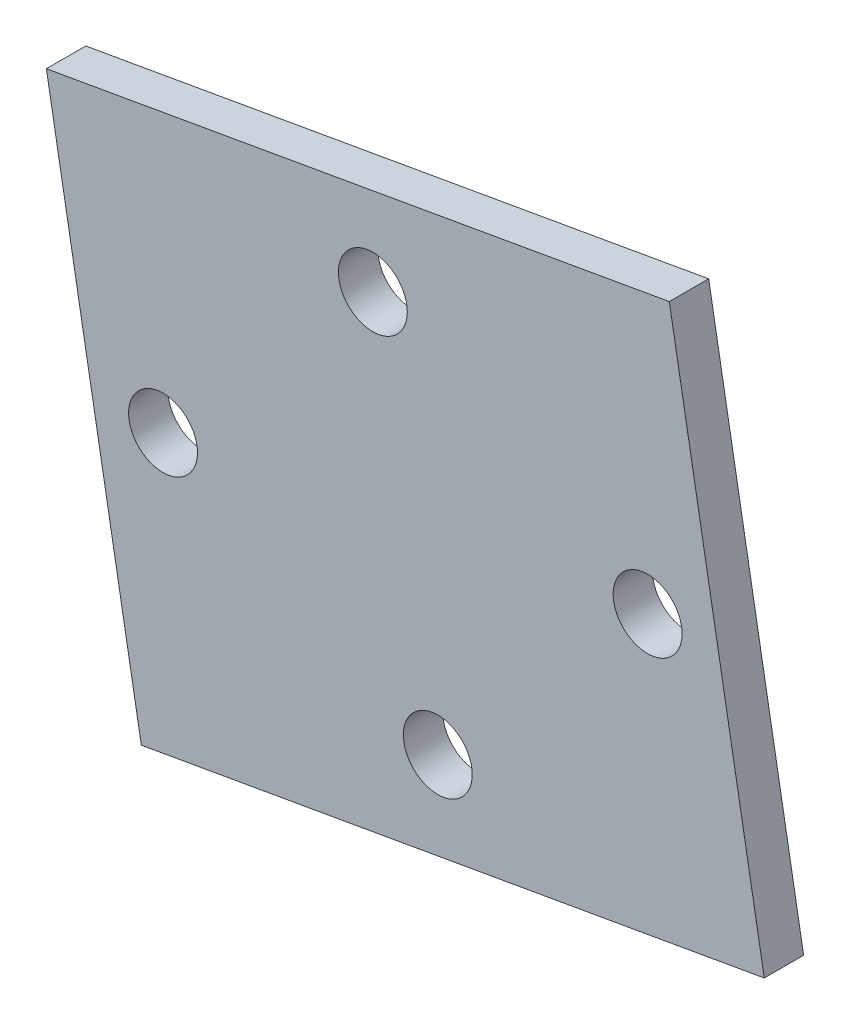
ISO-10303-21;
HEADER;
FILE_DESCRIPTION(('STEP AP214'),'2;1');
FILE_NAME('part.step','',(''),(''),'','','');
FILE_SCHEMA(('AUTOMOTIVE_DESIGN { 1 0 10303 214 1 1 1 1 }'));
ENDSEC;
DATA;
#1=APPLICATION_CONTEXT('core data for automotive mechanical design processes');
#2=APPLICATION_PROTOCOL_DEFINITION('international standard','automotive_design',2000,#1);
#3=PRODUCT_CONTEXT('',#1,'mechanical');
#4=PRODUCT('Part','Part','',(#3));
#5=PRODUCT_RELATED_PRODUCT_CATEGORY('part','',(#4));
#6=PRODUCT_DEFINITION_FORMATION('','',#4);
#7=PRODUCT_DEFINITION_CONTEXT('part definition',#1,'design');
#8=PRODUCT_DEFINITION('design','',#6,#7);
#9=PRODUCT_DEFINITION_SHAPE('','',#8);
#10=(LENGTH_UNIT() NAMED_UNIT(*) SI_UNIT(.MILLI.,.METRE.));
#11=(NAMED_UNIT(*) PLANE_ANGLE_UNIT() SI_UNIT($,.RADIAN.));
#12=(NAMED_UNIT(*) SI_UNIT($,.STERADIAN.) SOLID_ANGLE_UNIT());
#13=UNCERTAINTY_MEASURE_WITH_UNIT(LENGTH_MEASURE(1.E-05),#10,'distance_accuracy_value','');
#14=(GEOMETRIC_REPRESENTATION_CONTEXT(3) GLOBAL_UNCERTAINTY_ASSIGNED_CONTEXT((#13)) GLOBAL_UNIT_ASSIGNED_CONTEXT((#10,
#11,#12)) REPRESENTATION_CONTEXT('',''));
#15=CARTESIAN_POINT('',(0.,0.,0.));
#16=DIRECTION('',(0.,0.,1.));
#17=DIRECTION('',(1.,0.,0.));
#18=AXIS2_PLACEMENT_3D('',#15,#16,#17);
#19=CARTESIAN_POINT('',(15.8240886904825,2.79021378125586,1.));
#20=DIRECTION('',(0.984807753012207,0.173648177666938,0.));
#21=DIRECTION('',(-0.173648177666938,0.984807753012207,0.));
#22=AXIS2_PLACEMENT_3D('',#19,#20,#21);
#23=PLANE('',#22);
#24=DIRECTION('',(0.173648177666938,-0.984807753012207,0.));
#25=VECTOR('',#24,1.);
#26=CARTESIAN_POINT('',(15.8240886904825,2.79021378125586,-1.));
#27=LINE('',#26,#25);
#28=CARTESIAN_POINT('',(13.4127531902257,16.4655769648603,-1.));
#29=VERTEX_POINT('',#28);
#30=CARTESIAN_POINT('',(18.2354241907393,-10.8851494023485,-1.));
#31=VERTEX_POINT('',#30);
#32=EDGE_CURVE('E131',#29,#31,#27,.T.);
#33=ORIENTED_EDGE('',*,*,#32,.F.);
#34=DIRECTION('',(0.,0.,-1.));
#35=VECTOR('',#34,1.);
#36=CARTESIAN_POINT('',(13.4127531902257,16.4655769648603,1.));
#37=LINE('',#36,#35);
#38=CARTESIAN_POINT('',(13.4127531902257,16.4655769648603,1.));
#39=VERTEX_POINT('',#38);
#40=EDGE_CURVE('E11',#39,#29,#37,.T.);
#41=ORIENTED_EDGE('',*,*,#40,.F.);
#42=DIRECTION('',(0.173648177666938,-0.984807753012207,0.));
#43=VECTOR('',#42,1.);
#44=CARTESIAN_POINT('',(15.8240886904825,2.79021378125586,1.));
#45=LINE('',#44,#43);
#46=CARTESIAN_POINT('',(18.2354241907393,-10.8851494023485,1.));
#47=VERTEX_POINT('',#46);
#48=EDGE_CURVE('E106',#39,#47,#45,.T.);
#49=ORIENTED_EDGE('',*,*,#48,.T.);
#50=DIRECTION('',(0.,0.,-1.));
#51=VECTOR('',#50,1.);
#52=CARTESIAN_POINT('',(18.2354241907393,-10.8851494023485,1.));
#53=LINE('',#52,#51);
#54=EDGE_CURVE('E84',#47,#31,#53,.T.);
#55=ORIENTED_EDGE('',*,*,#54,.T.);
#56=EDGE_LOOP('',(#33,#41,#49,#55));
#57=FACE_BOUND('',#56,.T.);
#58=ADVANCED_FACE('F45',(#57),#23,.T.);
#59=CARTESIAN_POINT('',(-2.41133550025677,13.6753631836044,1.));
#60=DIRECTION('',(-0.173648177666938,0.984807753012207,0.));
#61=DIRECTION('',(-0.984807753012207,-0.173648177666938,0.));
#62=AXIS2_PLACEMENT_3D('',#59,#60,#61);
#63=PLANE('',#62);
#64=DIRECTION('',(0.984807753012207,0.173648177666938,0.));
#65=VECTOR('',#64,1.);
#66=CARTESIAN_POINT('',(-2.41133550025677,13.6753631836044,-1.));
#67=LINE('',#66,#65);
#68=CARTESIAN_POINT('',(-18.2354241907393,10.8851494023485,-1.));
#69=VERTEX_POINT('',#68);
#70=EDGE_CURVE('E97',#69,#29,#67,.T.);
#71=ORIENTED_EDGE('',*,*,#70,.F.);
#72=DIRECTION('',(0.,0.,-1.));
#73=VECTOR('',#72,1.);
#74=CARTESIAN_POINT('',(-18.2354241907393,10.8851494023485,1.));
#75=LINE('',#74,#73);
#76=CARTESIAN_POINT('',(-18.2354241907393,10.8851494023485,1.));
#77=VERTEX_POINT('',#76);
#78=EDGE_CURVE('E54',#77,#69,#75,.T.);
#79=ORIENTED_EDGE('',*,*,#78,.F.);
#80=DIRECTION('',(0.984807753012207,0.173648177666938,0.));
#81=VECTOR('',#80,1.);
#82=CARTESIAN_POINT('',(-2.41133550025677,13.6753631836044,1.));
#83=LINE('',#82,#81);
#84=EDGE_CURVE('E95',#77,#39,#83,.T.);
#85=ORIENTED_EDGE('',*,*,#84,.T.);
#86=ORIENTED_EDGE('',*,*,#40,.T.);
#87=EDGE_LOOP('',(#71,#79,#85,#86));
#88=FACE_BOUND('',#87,.T.);
#89=ADVANCED_FACE('F93',(#88),#63,.T.);
#90=CARTESIAN_POINT('',(-15.8240886904825,-2.79021378125586,1.));
#91=DIRECTION('',(0.984807753012207,0.173648177666938,0.));
#92=DIRECTION('',(-0.173648177666938,0.984807753012207,0.));
#93=AXIS2_PLACEMENT_3D('',#90,#91,#92);
#94=PLANE('',#93);
#95=DIRECTION('',(0.173648177666938,-0.984807753012207,0.));
#96=VECTOR('',#95,1.);
#97=CARTESIAN_POINT('',(-15.8240886904825,-2.79021378125586,-1.));
#98=LINE('',#97,#96);
#99=CARTESIAN_POINT('',(-13.4127531902257,-16.4655769648603,-1.));
#100=VERTEX_POINT('',#99);
#101=EDGE_CURVE('E77',#69,#100,#98,.T.);
#102=ORIENTED_EDGE('',*,*,#101,.T.);
#103=DIRECTION('',(0.,0.,-1.));
#104=VECTOR('',#103,1.);
#105=CARTESIAN_POINT('',(-13.4127531902257,-16.4655769648603,1.));
#106=LINE('',#105,#104);
#107=CARTESIAN_POINT('',(-13.4127531902257,-16.4655769648603,1.));
#108=VERTEX_POINT('',#107);
#109=EDGE_CURVE('E99',#108,#100,#106,.T.);
#110=ORIENTED_EDGE('',*,*,#109,.F.);
#111=DIRECTION('',(0.173648177666938,-0.984807753012207,0.));
#112=VECTOR('',#111,1.);
#113=CARTESIAN_POINT('',(-15.8240886904825,-2.79021378125586,1.));
#114=LINE('',#113,#112);
#115=EDGE_CURVE('E100',#77,#108,#114,.T.);
#116=ORIENTED_EDGE('',*,*,#115,.F.);
#117=ORIENTED_EDGE('',*,*,#78,.T.);
#118=EDGE_LOOP('',(#102,#110,#116,#117));
#119=FACE_BOUND('',#118,.T.);
#120=ADVANCED_FACE('F101',(#119),#94,.F.);
#121=CARTESIAN_POINT('',(-12.3100969126526,-2.17060222083673,1.));
#122=DIRECTION('',(0.,0.,-1.));
#123=DIRECTION('',(-1.,0.,0.));
#124=AXIS2_PLACEMENT_3D('',#121,#122,#123);
#125=CYLINDRICAL_SURFACE('',#124,1.75);
#126=CARTESIAN_POINT('',(-12.3100969126526,-2.17060222083673,1.));
#127=DIRECTION('',(0.,0.,1.));
#128=DIRECTION('',(1.,0.,0.));
#129=AXIS2_PLACEMENT_3D('',#126,#127,#128);
#130=CIRCLE('',#129,1.75);
#131=CARTESIAN_POINT('',(-10.5600969126526,-2.17060222083673,1.));
#132=VERTEX_POINT('',#131);
#133=EDGE_CURVE('E123',#132,#132,#130,.T.);
#134=ORIENTED_EDGE('',*,*,#133,.T.);
#135=EDGE_LOOP('',(#134));
#136=FACE_BOUND('',#135,.T.);
#137=CARTESIAN_POINT('',(-12.3100969126526,-2.17060222083673,-1.));
#138=DIRECTION('',(0.,0.,1.));
#139=DIRECTION('',(1.,0.,0.));
#140=AXIS2_PLACEMENT_3D('',#137,#138,#139);
#141=CIRCLE('',#140,1.75);
#142=CARTESIAN_POINT('',(-10.5600969126526,-2.17060222083673,-1.));
#143=VERTEX_POINT('',#142);
#144=EDGE_CURVE('E150',#143,#143,#141,.T.);
#145=ORIENTED_EDGE('',*,*,#144,.F.);
#146=EDGE_LOOP('',(#145));
#147=FACE_BOUND('',#146,.T.);
#148=ADVANCED_FACE('F173',(#136,#147),#125,.F.);
#149=CARTESIAN_POINT('',(1.64965768783591,-9.35567365361596,1.));
#150=DIRECTION('',(0.,0.,-1.));
#151=DIRECTION('',(-1.,0.,0.));
#152=AXIS2_PLACEMENT_3D('',#149,#150,#151);
#153=CYLINDRICAL_SURFACE('',#152,1.75);
#154=CARTESIAN_POINT('',(1.64965768783591,-9.35567365361596,1.));
#155=DIRECTION('',(0.,0.,1.));
#156=DIRECTION('',(1.,0.,0.));
#157=AXIS2_PLACEMENT_3D('',#154,#155,#156);
#158=CIRCLE('',#157,1.75);
#159=CARTESIAN_POINT('',(3.39965768783591,-9.35567365361596,1.));
#160=VERTEX_POINT('',#159);
#161=EDGE_CURVE('E119',#160,#160,#158,.T.);
#162=ORIENTED_EDGE('',*,*,#161,.T.);
#163=EDGE_LOOP('',(#162));
#164=FACE_BOUND('',#163,.T.);
#165=CARTESIAN_POINT('',(1.64965768783591,-9.35567365361596,-1.));
#166=DIRECTION('',(0.,0.,1.));
#167=DIRECTION('',(1.,0.,0.));
#168=AXIS2_PLACEMENT_3D('',#165,#166,#167);
#169=CIRCLE('',#168,1.75);
#170=CARTESIAN_POINT('',(3.39965768783591,-9.35567365361596,-1.));
#171=VERTEX_POINT('',#170);
#172=EDGE_CURVE('E146',#171,#171,#169,.T.);
#173=ORIENTED_EDGE('',*,*,#172,.F.);
#174=EDGE_LOOP('',(#173));
#175=FACE_BOUND('',#174,.T.);
#176=ADVANCED_FACE('F182',(#164,#175),#153,.F.);
#177=CARTESIAN_POINT('',(12.3100969126526,2.17060222083672,1.));
#178=DIRECTION('',(0.,0.,-1.));
#179=DIRECTION('',(-1.,0.,0.));
#180=AXIS2_PLACEMENT_3D('',#177,#178,#179);
#181=CYLINDRICAL_SURFACE('',#180,1.75);
#182=CARTESIAN_POINT('',(12.3100969126526,2.17060222083672,1.));
#183=DIRECTION('',(0.,0.,1.));
#184=DIRECTION('',(1.,0.,0.));
#185=AXIS2_PLACEMENT_3D('',#182,#183,#184);
#186=CIRCLE('',#185,1.75);
#187=CARTESIAN_POINT('',(14.0600969126526,2.17060222083672,1.));
#188=VERTEX_POINT('',#187);
#189=EDGE_CURVE('E115',#188,#188,#186,.T.);
#190=ORIENTED_EDGE('',*,*,#189,.T.);
#191=EDGE_LOOP('',(#190));
#192=FACE_BOUND('',#191,.T.);
#193=CARTESIAN_POINT('',(12.3100969126526,2.17060222083672,-1.));
#194=DIRECTION('',(0.,0.,1.));
#195=DIRECTION('',(1.,0.,0.));
#196=AXIS2_PLACEMENT_3D('',#193,#194,#195);
#197=CIRCLE('',#196,1.75);
#198=CARTESIAN_POINT('',(14.0600969126526,2.17060222083672,-1.));
#199=VERTEX_POINT('',#198);
#200=EDGE_CURVE('E142',#199,#199,#197,.T.);
#201=ORIENTED_EDGE('',*,*,#200,.F.);
#202=EDGE_LOOP('',(#201));
#203=FACE_BOUND('',#202,.T.);
#204=ADVANCED_FACE('F179',(#192,#203),#181,.F.);
#205=CARTESIAN_POINT('',(2.41133550025677,-13.6753631836044,1.));
#206=DIRECTION('',(-0.173648177666938,0.984807753012207,0.));
#207=DIRECTION('',(-0.984807753012207,-0.173648177666938,0.));
#208=AXIS2_PLACEMENT_3D('',#205,#206,#207);
#209=PLANE('',#208);
#210=DIRECTION('',(0.984807753012207,0.173648177666938,0.));
#211=VECTOR('',#210,1.);
#212=CARTESIAN_POINT('',(2.41133550025677,-13.6753631836044,-1.));
#213=LINE('',#212,#211);
#214=EDGE_CURVE('E139',#100,#31,#213,.T.);
#215=ORIENTED_EDGE('',*,*,#214,.T.);
#216=ORIENTED_EDGE('',*,*,#54,.F.);
#217=DIRECTION('',(0.984807753012207,0.173648177666938,0.));
#218=VECTOR('',#217,1.);
#219=CARTESIAN_POINT('',(2.41133550025677,-13.6753631836044,1.));
#220=LINE('',#219,#218);
#221=EDGE_CURVE('E62',#108,#47,#220,.T.);
#222=ORIENTED_EDGE('',*,*,#221,.F.);
#223=ORIENTED_EDGE('',*,*,#109,.T.);
#224=EDGE_LOOP('',(#215,#216,#222,#223));
#225=FACE_BOUND('',#224,.T.);
#226=ADVANCED_FACE('F162',(#225),#209,.F.);
#227=CARTESIAN_POINT('',(-1.64965768783591,9.35567365361597,1.));
#228=DIRECTION('',(0.,0.,-1.));
#229=DIRECTION('',(-1.,0.,0.));
#230=AXIS2_PLACEMENT_3D('',#227,#228,#229);
#231=CYLINDRICAL_SURFACE('',#230,1.75);
#232=CARTESIAN_POINT('',(-1.64965768783591,9.35567365361597,1.));
#233=DIRECTION('',(0.,0.,1.));
#234=DIRECTION('',(1.,0.,0.));
#235=AXIS2_PLACEMENT_3D('',#232,#233,#234);
#236=CIRCLE('',#235,1.75);
#237=CARTESIAN_POINT('',(0.100342312164093,9.35567365361597,1.));
#238=VERTEX_POINT('',#237);
#239=EDGE_CURVE('E127',#238,#238,#236,.T.);
#240=ORIENTED_EDGE('',*,*,#239,.T.);
#241=EDGE_LOOP('',(#240));
#242=FACE_BOUND('',#241,.T.);
#243=CARTESIAN_POINT('',(-1.64965768783591,9.35567365361597,-1.));
#244=DIRECTION('',(0.,0.,1.));
#245=DIRECTION('',(1.,0.,0.));
#246=AXIS2_PLACEMENT_3D('',#243,#244,#245);
#247=CIRCLE('',#246,1.75);
#248=CARTESIAN_POINT('',(0.100342312164093,9.35567365361597,-1.));
#249=VERTEX_POINT('',#248);
#250=EDGE_CURVE('E110',#249,#249,#247,.T.);
#251=ORIENTED_EDGE('',*,*,#250,.F.);
#252=EDGE_LOOP('',(#251));
#253=FACE_BOUND('',#252,.T.);
#254=ADVANCED_FACE('F178',(#242,#253),#231,.F.);
#255=CARTESIAN_POINT('',(0.,0.,1.));
#256=DIRECTION('',(0.,0.,1.));
#257=DIRECTION('',(1.,0.,0.));
#258=AXIS2_PLACEMENT_3D('',#255,#256,#257);
#259=PLANE('',#258);
#260=ORIENTED_EDGE('',*,*,#48,.F.);
#261=ORIENTED_EDGE('',*,*,#84,.F.);
#262=ORIENTED_EDGE('',*,*,#115,.T.);
#263=ORIENTED_EDGE('',*,*,#221,.T.);
#264=EDGE_LOOP('',(#260,#261,#262,#263));
#265=FACE_BOUND('',#264,.T.);
#266=ORIENTED_EDGE('',*,*,#189,.F.);
#267=EDGE_LOOP('',(#266));
#268=FACE_BOUND('',#267,.T.);
#269=ORIENTED_EDGE('',*,*,#161,.F.);
#270=EDGE_LOOP('',(#269));
#271=FACE_BOUND('',#270,.T.);
#272=ORIENTED_EDGE('',*,*,#133,.F.);
#273=EDGE_LOOP('',(#272));
#274=FACE_BOUND('',#273,.T.);
#275=ORIENTED_EDGE('',*,*,#239,.F.);
#276=EDGE_LOOP('',(#275));
#277=FACE_BOUND('',#276,.T.);
#278=ADVANCED_FACE('F104',(#265,#268,#271,#274,#277),#259,.T.);
#279=CARTESIAN_POINT('',(0.,0.,-1.));
#280=DIRECTION('',(0.,0.,1.));
#281=DIRECTION('',(1.,0.,0.));
#282=AXIS2_PLACEMENT_3D('',#279,#280,#281);
#283=PLANE('',#282);
#284=ORIENTED_EDGE('',*,*,#32,.T.);
#285=ORIENTED_EDGE('',*,*,#214,.F.);
#286=ORIENTED_EDGE('',*,*,#101,.F.);
#287=ORIENTED_EDGE('',*,*,#70,.T.);
#288=EDGE_LOOP('',(#284,#285,#286,#287));
#289=FACE_BOUND('',#288,.T.);
#290=ORIENTED_EDGE('',*,*,#200,.T.);
#291=EDGE_LOOP('',(#290));
#292=FACE_BOUND('',#291,.T.);
#293=ORIENTED_EDGE('',*,*,#172,.T.);
#294=EDGE_LOOP('',(#293));
#295=FACE_BOUND('',#294,.T.);
#296=ORIENTED_EDGE('',*,*,#144,.T.);
#297=EDGE_LOOP('',(#296));
#298=FACE_BOUND('',#297,.T.);
#299=ORIENTED_EDGE('',*,*,#250,.T.);
#300=EDGE_LOOP('',(#299));
#301=FACE_BOUND('',#300,.T.);
#302=ADVANCED_FACE('F164',(#289,#292,#295,#298,#301),#283,.F.);
#303=CLOSED_SHELL('',(#58,#89,#120,#148,#176,#204,#226,#254,#278,#302));
#304=MANIFOLD_SOLID_BREP('B2',#303);
#305=ADVANCED_BREP_SHAPE_REPRESENTATION('',(#18,#304),#14);
#306=SHAPE_DEFINITION_REPRESENTATION(#9,#305);
ENDSEC;
END-ISO-10303-21;
